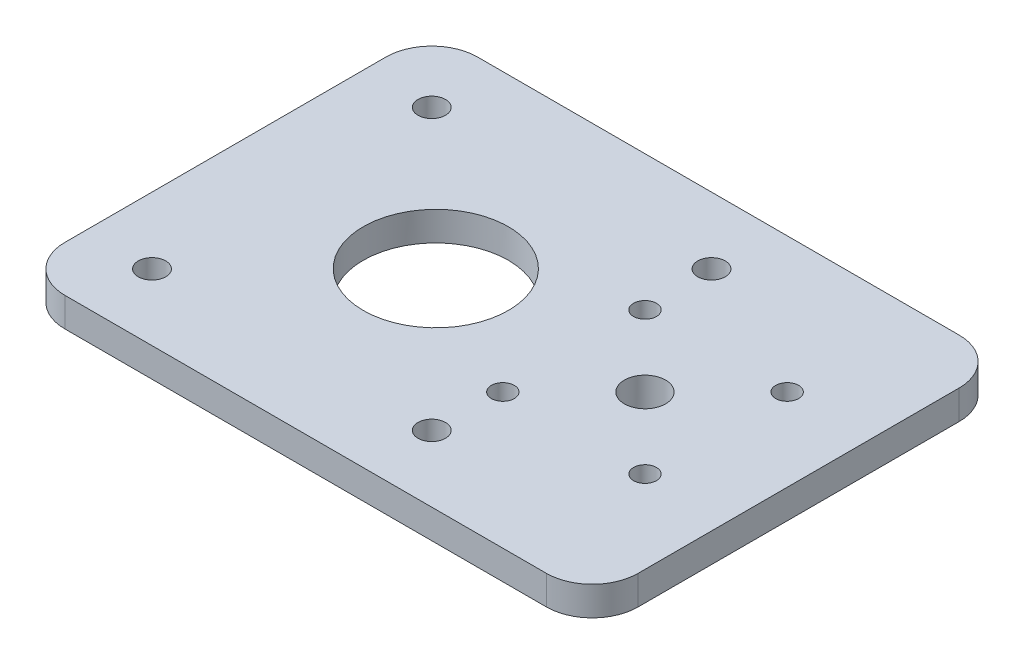
ISO-10303-21;
HEADER;
FILE_DESCRIPTION(('STEP AP214'),'2;1');
FILE_NAME('part.step','',(''),(''),'','','');
FILE_SCHEMA(('AUTOMOTIVE_DESIGN { 1 0 10303 214 1 1 1 1 }'));
ENDSEC;
DATA;
#1=APPLICATION_CONTEXT('core data for automotive mechanical design processes');
#2=APPLICATION_PROTOCOL_DEFINITION('international standard','automotive_design',2000,#1);
#3=PRODUCT_CONTEXT('',#1,'mechanical');
#4=PRODUCT('Part','Part','',(#3));
#5=PRODUCT_RELATED_PRODUCT_CATEGORY('part','',(#4));
#6=PRODUCT_DEFINITION_FORMATION('','',#4);
#7=PRODUCT_DEFINITION_CONTEXT('part definition',#1,'design');
#8=PRODUCT_DEFINITION('design','',#6,#7);
#9=PRODUCT_DEFINITION_SHAPE('','',#8);
#10=(LENGTH_UNIT() NAMED_UNIT(*) SI_UNIT(.MILLI.,.METRE.));
#11=(NAMED_UNIT(*) PLANE_ANGLE_UNIT() SI_UNIT($,.RADIAN.));
#12=(NAMED_UNIT(*) SI_UNIT($,.STERADIAN.) SOLID_ANGLE_UNIT());
#13=UNCERTAINTY_MEASURE_WITH_UNIT(LENGTH_MEASURE(1.E-05),#10,'distance_accuracy_value','');
#14=(GEOMETRIC_REPRESENTATION_CONTEXT(3) GLOBAL_UNCERTAINTY_ASSIGNED_CONTEXT((#13)) GLOBAL_UNIT_ASSIGNED_CONTEXT((#10,
#11,#12)) REPRESENTATION_CONTEXT('',''));
#15=CARTESIAN_POINT('',(0.,0.,0.));
#16=DIRECTION('',(0.,0.,1.));
#17=DIRECTION('',(1.,0.,0.));
#18=AXIS2_PLACEMENT_3D('',#15,#16,#17);
#19=CARTESIAN_POINT('',(0.,6.35,0.));
#20=DIRECTION('',(1.,0.,0.));
#21=DIRECTION('',(0.,0.,-1.));
#22=AXIS2_PLACEMENT_3D('',#19,#20,#21);
#23=PLANE('',#22);
#24=DIRECTION('',(0.,0.,1.));
#25=VECTOR('',#24,1.);
#26=CARTESIAN_POINT('',(0.,0.,0.));
#27=LINE('',#26,#25);
#28=CARTESIAN_POINT('',(0.,0.,-80.));
#29=VERTEX_POINT('',#28);
#30=CARTESIAN_POINT('',(0.,0.,-10.));
#31=VERTEX_POINT('',#30);
#32=EDGE_CURVE('E126',#29,#31,#27,.T.);
#33=ORIENTED_EDGE('',*,*,#32,.T.);
#34=DIRECTION('',(0.,-1.,0.));
#35=VECTOR('',#34,1.);
#36=CARTESIAN_POINT('',(0.,6.35,-10.));
#37=LINE('',#36,#35);
#38=CARTESIAN_POINT('',(0.,6.35,-10.));
#39=VERTEX_POINT('',#38);
#40=EDGE_CURVE('E104',#31,#39,#37,.F.);
#41=ORIENTED_EDGE('',*,*,#40,.T.);
#42=DIRECTION('',(0.,0.,1.));
#43=VECTOR('',#42,1.);
#44=CARTESIAN_POINT('',(0.,6.35,0.));
#45=LINE('',#44,#43);
#46=CARTESIAN_POINT('',(0.,6.35,-80.));
#47=VERTEX_POINT('',#46);
#48=EDGE_CURVE('E136',#47,#39,#45,.T.);
#49=ORIENTED_EDGE('',*,*,#48,.F.);
#50=DIRECTION('',(0.,-1.,0.));
#51=VECTOR('',#50,1.);
#52=CARTESIAN_POINT('',(0.,6.35,-80.));
#53=LINE('',#52,#51);
#54=EDGE_CURVE('E109',#47,#29,#53,.T.);
#55=ORIENTED_EDGE('',*,*,#54,.T.);
#56=EDGE_LOOP('',(#33,#41,#49,#55));
#57=FACE_BOUND('',#56,.T.);
#58=ADVANCED_FACE('F32',(#57),#23,.F.);
#59=CARTESIAN_POINT('',(0.,6.35,0.));
#60=DIRECTION('',(0.,0.,-1.));
#61=DIRECTION('',(-1.,0.,0.));
#62=AXIS2_PLACEMENT_3D('',#59,#60,#61);
#63=PLANE('',#62);
#64=DIRECTION('',(1.,0.,0.));
#65=VECTOR('',#64,1.);
#66=CARTESIAN_POINT('',(0.,6.35,0.));
#67=LINE('',#66,#65);
#68=CARTESIAN_POINT('',(10.,6.35,0.));
#69=VERTEX_POINT('',#68);
#70=CARTESIAN_POINT('',(115.,6.35,0.));
#71=VERTEX_POINT('',#70);
#72=EDGE_CURVE('E119',#69,#71,#67,.T.);
#73=ORIENTED_EDGE('',*,*,#72,.F.);
#74=DIRECTION('',(0.,-1.,0.));
#75=VECTOR('',#74,1.);
#76=CARTESIAN_POINT('',(10.,6.35,0.));
#77=LINE('',#76,#75);
#78=CARTESIAN_POINT('',(10.,0.,0.));
#79=VERTEX_POINT('',#78);
#80=EDGE_CURVE('E103',#69,#79,#77,.T.);
#81=ORIENTED_EDGE('',*,*,#80,.T.);
#82=DIRECTION('',(1.,0.,0.));
#83=VECTOR('',#82,1.);
#84=CARTESIAN_POINT('',(0.,0.,0.));
#85=LINE('',#84,#83);
#86=CARTESIAN_POINT('',(115.,0.,0.));
#87=VERTEX_POINT('',#86);
#88=EDGE_CURVE('E116',#79,#87,#85,.T.);
#89=ORIENTED_EDGE('',*,*,#88,.T.);
#90=DIRECTION('',(0.,-1.,0.));
#91=VECTOR('',#90,1.);
#92=CARTESIAN_POINT('',(115.,6.35,0.));
#93=LINE('',#92,#91);
#94=EDGE_CURVE('E121',#87,#71,#93,.F.);
#95=ORIENTED_EDGE('',*,*,#94,.T.);
#96=EDGE_LOOP('',(#73,#81,#89,#95));
#97=FACE_BOUND('',#96,.T.);
#98=ADVANCED_FACE('F115',(#97),#63,.F.);
#99=CARTESIAN_POINT('',(125.,6.35,0.));
#100=DIRECTION('',(-1.,0.,0.));
#101=DIRECTION('',(0.,0.,1.));
#102=AXIS2_PLACEMENT_3D('',#99,#100,#101);
#103=PLANE('',#102);
#104=DIRECTION('',(0.,0.,-1.));
#105=VECTOR('',#104,1.);
#106=CARTESIAN_POINT('',(125.,0.,0.));
#107=LINE('',#106,#105);
#108=CARTESIAN_POINT('',(125.,0.,-10.));
#109=VERTEX_POINT('',#108);
#110=CARTESIAN_POINT('',(125.,0.,-80.));
#111=VERTEX_POINT('',#110);
#112=EDGE_CURVE('E125',#109,#111,#107,.T.);
#113=ORIENTED_EDGE('',*,*,#112,.T.);
#114=DIRECTION('',(0.,-1.,0.));
#115=VECTOR('',#114,1.);
#116=CARTESIAN_POINT('',(125.,6.35,-80.));
#117=LINE('',#116,#115);
#118=CARTESIAN_POINT('',(125.,6.35,-80.));
#119=VERTEX_POINT('',#118);
#120=EDGE_CURVE('E11',#111,#119,#117,.F.);
#121=ORIENTED_EDGE('',*,*,#120,.T.);
#122=DIRECTION('',(0.,0.,-1.));
#123=VECTOR('',#122,1.);
#124=CARTESIAN_POINT('',(125.,6.35,0.));
#125=LINE('',#124,#123);
#126=CARTESIAN_POINT('',(125.,6.35,-10.));
#127=VERTEX_POINT('',#126);
#128=EDGE_CURVE('E198',#127,#119,#125,.T.);
#129=ORIENTED_EDGE('',*,*,#128,.F.);
#130=DIRECTION('',(0.,-1.,0.));
#131=VECTOR('',#130,1.);
#132=CARTESIAN_POINT('',(125.,6.35,-10.));
#133=LINE('',#132,#131);
#134=EDGE_CURVE('E41',#127,#109,#133,.T.);
#135=ORIENTED_EDGE('',*,*,#134,.T.);
#136=EDGE_LOOP('',(#113,#121,#129,#135));
#137=FACE_BOUND('',#136,.T.);
#138=ADVANCED_FACE('F196',(#137),#103,.F.);
#139=CARTESIAN_POINT('',(0.,6.35,-90.));
#140=DIRECTION('',(0.,0.,1.));
#141=DIRECTION('',(1.,0.,0.));
#142=AXIS2_PLACEMENT_3D('',#139,#140,#141);
#143=PLANE('',#142);
#144=DIRECTION('',(-1.,0.,0.));
#145=VECTOR('',#144,1.);
#146=CARTESIAN_POINT('',(0.,0.,-90.));
#147=LINE('',#146,#145);
#148=CARTESIAN_POINT('',(115.,0.,-90.));
#149=VERTEX_POINT('',#148);
#150=CARTESIAN_POINT('',(10.,0.,-90.));
#151=VERTEX_POINT('',#150);
#152=EDGE_CURVE('E129',#149,#151,#147,.T.);
#153=ORIENTED_EDGE('',*,*,#152,.T.);
#154=DIRECTION('',(0.,-1.,0.));
#155=VECTOR('',#154,1.);
#156=CARTESIAN_POINT('',(10.,6.35,-90.));
#157=LINE('',#156,#155);
#158=CARTESIAN_POINT('',(10.,6.35,-90.));
#159=VERTEX_POINT('',#158);
#160=EDGE_CURVE('E48',#151,#159,#157,.F.);
#161=ORIENTED_EDGE('',*,*,#160,.T.);
#162=DIRECTION('',(-1.,0.,0.));
#163=VECTOR('',#162,1.);
#164=CARTESIAN_POINT('',(0.,6.35,-90.));
#165=LINE('',#164,#163);
#166=CARTESIAN_POINT('',(115.,6.35,-90.));
#167=VERTEX_POINT('',#166);
#168=EDGE_CURVE('E172',#167,#159,#165,.T.);
#169=ORIENTED_EDGE('',*,*,#168,.F.);
#170=DIRECTION('',(0.,-1.,0.));
#171=VECTOR('',#170,1.);
#172=CARTESIAN_POINT('',(115.,6.35,-90.));
#173=LINE('',#172,#171);
#174=EDGE_CURVE('E188',#167,#149,#173,.T.);
#175=ORIENTED_EDGE('',*,*,#174,.T.);
#176=EDGE_LOOP('',(#153,#161,#169,#175));
#177=FACE_BOUND('',#176,.T.);
#178=ADVANCED_FACE('F205',(#177),#143,.F.);
#179=CARTESIAN_POINT('',(0.,6.35,0.));
#180=DIRECTION('',(0.,-1.,0.));
#181=DIRECTION('',(0.,0.,-1.));
#182=AXIS2_PLACEMENT_3D('',#179,#180,#181);
#183=PLANE('',#182);
#184=CARTESIAN_POINT('',(45.3898859795867,6.35,-45.4966713954477));
#185=DIRECTION('',(0.,1.,0.));
#186=DIRECTION('',(0.,0.,1.));
#187=AXIS2_PLACEMENT_3D('',#184,#185,#186);
#188=CIRCLE('',#187,15.8256034533935);
#189=CARTESIAN_POINT('',(45.3898859795867,6.35,-29.6710679420542));
#190=VERTEX_POINT('',#189);
#191=EDGE_CURVE('E230',#190,#190,#188,.T.);
#192=ORIENTED_EDGE('',*,*,#191,.F.);
#193=EDGE_LOOP('',(#192));
#194=FACE_BOUND('',#193,.T.);
#195=CARTESIAN_POINT('',(107.,6.35,-29.5000000000002));
#196=DIRECTION('',(0.,1.,0.));
#197=DIRECTION('',(0.,0.,1.));
#198=AXIS2_PLACEMENT_3D('',#195,#196,#197);
#199=CIRCLE('',#198,2.49999999999998);
#200=CARTESIAN_POINT('',(107.,6.35,-27.0000000000002));
#201=VERTEX_POINT('',#200);
#202=EDGE_CURVE('E171',#201,#201,#199,.T.);
#203=ORIENTED_EDGE('',*,*,#202,.F.);
#204=EDGE_LOOP('',(#203));
#205=FACE_BOUND('',#204,.T.);
#206=CARTESIAN_POINT('',(76.0000000000003,6.35,-29.5));
#207=DIRECTION('',(0.,1.,0.));
#208=DIRECTION('',(0.,0.,1.));
#209=AXIS2_PLACEMENT_3D('',#206,#207,#208);
#210=CIRCLE('',#209,2.49999999999999);
#211=CARTESIAN_POINT('',(76.0000000000003,6.35,-27.));
#212=VERTEX_POINT('',#211);
#213=EDGE_CURVE('E167',#212,#212,#210,.T.);
#214=ORIENTED_EDGE('',*,*,#213,.F.);
#215=EDGE_LOOP('',(#214));
#216=FACE_BOUND('',#215,.T.);
#217=CARTESIAN_POINT('',(76.,6.35,-60.5));
#218=DIRECTION('',(0.,1.,0.));
#219=DIRECTION('',(0.,0.,1.));
#220=AXIS2_PLACEMENT_3D('',#217,#218,#219);
#221=CIRCLE('',#220,2.5);
#222=CARTESIAN_POINT('',(76.,6.35,-58.));
#223=VERTEX_POINT('',#222);
#224=EDGE_CURVE('E163',#223,#223,#221,.T.);
#225=ORIENTED_EDGE('',*,*,#224,.F.);
#226=EDGE_LOOP('',(#225));
#227=FACE_BOUND('',#226,.T.);
#228=CARTESIAN_POINT('',(107.,6.35,-60.5000000000002));
#229=DIRECTION('',(0.,1.,0.));
#230=DIRECTION('',(0.,0.,1.));
#231=AXIS2_PLACEMENT_3D('',#228,#229,#230);
#232=CIRCLE('',#231,2.50000000000001);
#233=CARTESIAN_POINT('',(107.,6.35,-58.0000000000002));
#234=VERTEX_POINT('',#233);
#235=EDGE_CURVE('E159',#234,#234,#232,.T.);
#236=ORIENTED_EDGE('',*,*,#235,.F.);
#237=EDGE_LOOP('',(#236));
#238=FACE_BOUND('',#237,.T.);
#239=CARTESIAN_POINT('',(91.5,6.35,-45.));
#240=DIRECTION('',(0.,1.,0.));
#241=DIRECTION('',(0.,0.,1.));
#242=AXIS2_PLACEMENT_3D('',#239,#240,#241);
#243=CIRCLE('',#242,4.50000000000001);
#244=CARTESIAN_POINT('',(91.5,6.35,-40.5));
#245=VERTEX_POINT('',#244);
#246=EDGE_CURVE('E155',#245,#245,#243,.T.);
#247=ORIENTED_EDGE('',*,*,#246,.F.);
#248=EDGE_LOOP('',(#247));
#249=FACE_BOUND('',#248,.T.);
#250=CARTESIAN_POINT('',(14.5,6.35,-75.5));
#251=DIRECTION('',(0.,1.,0.));
#252=DIRECTION('',(0.,0.,1.));
#253=AXIS2_PLACEMENT_3D('',#250,#251,#252);
#254=CIRCLE('',#253,3.00000000000001);
#255=CARTESIAN_POINT('',(14.5,6.35,-72.5));
#256=VERTEX_POINT('',#255);
#257=EDGE_CURVE('E151',#256,#256,#254,.T.);
#258=ORIENTED_EDGE('',*,*,#257,.F.);
#259=EDGE_LOOP('',(#258));
#260=FACE_BOUND('',#259,.T.);
#261=CARTESIAN_POINT('',(75.5,6.35,-75.5));
#262=DIRECTION('',(0.,1.,0.));
#263=DIRECTION('',(0.,0.,1.));
#264=AXIS2_PLACEMENT_3D('',#261,#262,#263);
#265=CIRCLE('',#264,3.00000000000001);
#266=CARTESIAN_POINT('',(75.5,6.35,-72.5));
#267=VERTEX_POINT('',#266);
#268=EDGE_CURVE('E147',#267,#267,#265,.F.);
#269=ORIENTED_EDGE('',*,*,#268,.T.);
#270=EDGE_LOOP('',(#269));
#271=FACE_BOUND('',#270,.T.);
#272=CARTESIAN_POINT('',(75.5,6.35,-14.5));
#273=DIRECTION('',(0.,1.,0.));
#274=DIRECTION('',(0.,0.,1.));
#275=AXIS2_PLACEMENT_3D('',#272,#273,#274);
#276=CIRCLE('',#275,3.00000000000001);
#277=CARTESIAN_POINT('',(75.5,6.35,-11.5));
#278=VERTEX_POINT('',#277);
#279=EDGE_CURVE('E143',#278,#278,#276,.T.);
#280=ORIENTED_EDGE('',*,*,#279,.F.);
#281=EDGE_LOOP('',(#280));
#282=FACE_BOUND('',#281,.T.);
#283=CARTESIAN_POINT('',(14.5,6.35,-14.5));
#284=DIRECTION('',(0.,1.,0.));
#285=DIRECTION('',(0.,0.,1.));
#286=AXIS2_PLACEMENT_3D('',#283,#284,#285);
#287=CIRCLE('',#286,3.);
#288=CARTESIAN_POINT('',(14.5,6.35,-11.5));
#289=VERTEX_POINT('',#288);
#290=EDGE_CURVE('E139',#289,#289,#287,.F.);
#291=ORIENTED_EDGE('',*,*,#290,.T.);
#292=EDGE_LOOP('',(#291));
#293=FACE_BOUND('',#292,.T.);
#294=ORIENTED_EDGE('',*,*,#48,.T.);
#295=CARTESIAN_POINT('',(10.,6.35,-10.));
#296=DIRECTION('',(0.,-1.,0.));
#297=DIRECTION('',(0.,0.,-1.));
#298=AXIS2_PLACEMENT_3D('',#295,#296,#297);
#299=CIRCLE('',#298,10.);
#300=EDGE_CURVE('E186',#39,#69,#299,.F.);
#301=ORIENTED_EDGE('',*,*,#300,.T.);
#302=ORIENTED_EDGE('',*,*,#72,.T.);
#303=CARTESIAN_POINT('',(115.,6.35,-10.));
#304=DIRECTION('',(0.,-1.,0.));
#305=DIRECTION('',(0.,0.,-1.));
#306=AXIS2_PLACEMENT_3D('',#303,#304,#305);
#307=CIRCLE('',#306,10.);
#308=EDGE_CURVE('E181',#71,#127,#307,.F.);
#309=ORIENTED_EDGE('',*,*,#308,.T.);
#310=ORIENTED_EDGE('',*,*,#128,.T.);
#311=CARTESIAN_POINT('',(115.,6.35,-80.));
#312=DIRECTION('',(0.,-1.,0.));
#313=DIRECTION('',(0.,0.,-1.));
#314=AXIS2_PLACEMENT_3D('',#311,#312,#313);
#315=CIRCLE('',#314,10.);
#316=EDGE_CURVE('E55',#119,#167,#315,.F.);
#317=ORIENTED_EDGE('',*,*,#316,.T.);
#318=ORIENTED_EDGE('',*,*,#168,.T.);
#319=CARTESIAN_POINT('',(10.,6.35,-80.));
#320=DIRECTION('',(0.,-1.,0.));
#321=DIRECTION('',(0.,0.,-1.));
#322=AXIS2_PLACEMENT_3D('',#319,#320,#321);
#323=CIRCLE('',#322,10.);
#324=EDGE_CURVE('E184',#159,#47,#323,.F.);
#325=ORIENTED_EDGE('',*,*,#324,.T.);
#326=EDGE_LOOP('',(#294,#301,#302,#309,#310,#317,#318,#325));
#327=FACE_BOUND('',#326,.T.);
#328=ADVANCED_FACE('F242',(#194,#205,#216,#227,#238,#249,#260,#271,#282,#293,#327),#183,.F.);
#329=CARTESIAN_POINT('',(0.,0.,0.));
#330=DIRECTION('',(0.,-1.,0.));
#331=DIRECTION('',(0.,0.,-1.));
#332=AXIS2_PLACEMENT_3D('',#329,#330,#331);
#333=PLANE('',#332);
#334=CARTESIAN_POINT('',(45.3898859795867,0.,-45.4966713954477));
#335=DIRECTION('',(0.,-1.,0.));
#336=DIRECTION('',(0.,0.,-1.));
#337=AXIS2_PLACEMENT_3D('',#334,#335,#336);
#338=CIRCLE('',#337,15.8256034533935);
#339=CARTESIAN_POINT('',(45.3898859795867,0.,-61.3222748488411));
#340=VERTEX_POINT('',#339);
#341=EDGE_CURVE('E36',#340,#340,#338,.T.);
#342=ORIENTED_EDGE('',*,*,#341,.F.);
#343=EDGE_LOOP('',(#342));
#344=FACE_BOUND('',#343,.T.);
#345=CARTESIAN_POINT('',(107.,0.,-29.5000000000002));
#346=DIRECTION('',(0.,-1.,0.));
#347=DIRECTION('',(0.,0.,-1.));
#348=AXIS2_PLACEMENT_3D('',#345,#346,#347);
#349=CIRCLE('',#348,2.49999999999998);
#350=CARTESIAN_POINT('',(107.,0.,-32.0000000000002));
#351=VERTEX_POINT('',#350);
#352=EDGE_CURVE('E168',#351,#351,#349,.T.);
#353=ORIENTED_EDGE('',*,*,#352,.F.);
#354=EDGE_LOOP('',(#353));
#355=FACE_BOUND('',#354,.T.);
#356=CARTESIAN_POINT('',(76.0000000000003,0.,-29.5));
#357=DIRECTION('',(0.,-1.,0.));
#358=DIRECTION('',(0.,0.,-1.));
#359=AXIS2_PLACEMENT_3D('',#356,#357,#358);
#360=CIRCLE('',#359,2.49999999999999);
#361=CARTESIAN_POINT('',(76.0000000000003,0.,-32.));
#362=VERTEX_POINT('',#361);
#363=EDGE_CURVE('E164',#362,#362,#360,.T.);
#364=ORIENTED_EDGE('',*,*,#363,.F.);
#365=EDGE_LOOP('',(#364));
#366=FACE_BOUND('',#365,.T.);
#367=CARTESIAN_POINT('',(76.,0.,-60.5));
#368=DIRECTION('',(0.,-1.,0.));
#369=DIRECTION('',(0.,0.,-1.));
#370=AXIS2_PLACEMENT_3D('',#367,#368,#369);
#371=CIRCLE('',#370,2.5);
#372=CARTESIAN_POINT('',(76.,0.,-63.));
#373=VERTEX_POINT('',#372);
#374=EDGE_CURVE('E160',#373,#373,#371,.T.);
#375=ORIENTED_EDGE('',*,*,#374,.F.);
#376=EDGE_LOOP('',(#375));
#377=FACE_BOUND('',#376,.T.);
#378=CARTESIAN_POINT('',(107.,0.,-60.5000000000002));
#379=DIRECTION('',(0.,-1.,0.));
#380=DIRECTION('',(0.,0.,-1.));
#381=AXIS2_PLACEMENT_3D('',#378,#379,#380);
#382=CIRCLE('',#381,2.50000000000001);
#383=CARTESIAN_POINT('',(107.,0.,-63.0000000000002));
#384=VERTEX_POINT('',#383);
#385=EDGE_CURVE('E156',#384,#384,#382,.T.);
#386=ORIENTED_EDGE('',*,*,#385,.F.);
#387=EDGE_LOOP('',(#386));
#388=FACE_BOUND('',#387,.T.);
#389=CARTESIAN_POINT('',(91.5,0.,-45.));
#390=DIRECTION('',(0.,-1.,0.));
#391=DIRECTION('',(0.,0.,-1.));
#392=AXIS2_PLACEMENT_3D('',#389,#390,#391);
#393=CIRCLE('',#392,4.50000000000001);
#394=CARTESIAN_POINT('',(91.5,0.,-49.5));
#395=VERTEX_POINT('',#394);
#396=EDGE_CURVE('E152',#395,#395,#393,.T.);
#397=ORIENTED_EDGE('',*,*,#396,.F.);
#398=EDGE_LOOP('',(#397));
#399=FACE_BOUND('',#398,.T.);
#400=CARTESIAN_POINT('',(14.5,0.,-75.5));
#401=DIRECTION('',(0.,-1.,0.));
#402=DIRECTION('',(0.,0.,-1.));
#403=AXIS2_PLACEMENT_3D('',#400,#401,#402);
#404=CIRCLE('',#403,3.00000000000001);
#405=CARTESIAN_POINT('',(14.5,0.,-78.5));
#406=VERTEX_POINT('',#405);
#407=EDGE_CURVE('E148',#406,#406,#404,.T.);
#408=ORIENTED_EDGE('',*,*,#407,.F.);
#409=EDGE_LOOP('',(#408));
#410=FACE_BOUND('',#409,.T.);
#411=CARTESIAN_POINT('',(75.5,0.,-75.5));
#412=DIRECTION('',(0.,-1.,0.));
#413=DIRECTION('',(0.,0.,-1.));
#414=AXIS2_PLACEMENT_3D('',#411,#412,#413);
#415=CIRCLE('',#414,3.00000000000001);
#416=CARTESIAN_POINT('',(75.5,0.,-78.5));
#417=VERTEX_POINT('',#416);
#418=EDGE_CURVE('E144',#417,#417,#415,.F.);
#419=ORIENTED_EDGE('',*,*,#418,.T.);
#420=EDGE_LOOP('',(#419));
#421=FACE_BOUND('',#420,.T.);
#422=CARTESIAN_POINT('',(75.5,0.,-14.5));
#423=DIRECTION('',(0.,-1.,0.));
#424=DIRECTION('',(0.,0.,-1.));
#425=AXIS2_PLACEMENT_3D('',#422,#423,#424);
#426=CIRCLE('',#425,3.00000000000001);
#427=CARTESIAN_POINT('',(75.5,0.,-17.5));
#428=VERTEX_POINT('',#427);
#429=EDGE_CURVE('E140',#428,#428,#426,.T.);
#430=ORIENTED_EDGE('',*,*,#429,.F.);
#431=EDGE_LOOP('',(#430));
#432=FACE_BOUND('',#431,.T.);
#433=CARTESIAN_POINT('',(14.5,0.,-14.5));
#434=DIRECTION('',(0.,-1.,0.));
#435=DIRECTION('',(0.,0.,-1.));
#436=AXIS2_PLACEMENT_3D('',#433,#434,#435);
#437=CIRCLE('',#436,3.);
#438=CARTESIAN_POINT('',(14.5,0.,-17.5));
#439=VERTEX_POINT('',#438);
#440=EDGE_CURVE('E131',#439,#439,#437,.F.);
#441=ORIENTED_EDGE('',*,*,#440,.T.);
#442=EDGE_LOOP('',(#441));
#443=FACE_BOUND('',#442,.T.);
#444=ORIENTED_EDGE('',*,*,#88,.F.);
#445=CARTESIAN_POINT('',(10.,0.,-10.));
#446=DIRECTION('',(0.,-1.,0.));
#447=DIRECTION('',(0.,0.,-1.));
#448=AXIS2_PLACEMENT_3D('',#445,#446,#447);
#449=CIRCLE('',#448,10.);
#450=EDGE_CURVE('E99',#79,#31,#449,.T.);
#451=ORIENTED_EDGE('',*,*,#450,.T.);
#452=ORIENTED_EDGE('',*,*,#32,.F.);
#453=CARTESIAN_POINT('',(10.,0.,-80.));
#454=DIRECTION('',(0.,-1.,0.));
#455=DIRECTION('',(0.,0.,-1.));
#456=AXIS2_PLACEMENT_3D('',#453,#454,#455);
#457=CIRCLE('',#456,10.);
#458=EDGE_CURVE('E110',#29,#151,#457,.T.);
#459=ORIENTED_EDGE('',*,*,#458,.T.);
#460=ORIENTED_EDGE('',*,*,#152,.F.);
#461=CARTESIAN_POINT('',(115.,0.,-80.));
#462=DIRECTION('',(0.,-1.,0.));
#463=DIRECTION('',(0.,0.,-1.));
#464=AXIS2_PLACEMENT_3D('',#461,#462,#463);
#465=CIRCLE('',#464,10.);
#466=EDGE_CURVE('E175',#149,#111,#465,.T.);
#467=ORIENTED_EDGE('',*,*,#466,.T.);
#468=ORIENTED_EDGE('',*,*,#112,.F.);
#469=CARTESIAN_POINT('',(115.,0.,-10.));
#470=DIRECTION('',(0.,-1.,0.));
#471=DIRECTION('',(0.,0.,-1.));
#472=AXIS2_PLACEMENT_3D('',#469,#470,#471);
#473=CIRCLE('',#472,10.);
#474=EDGE_CURVE('E120',#109,#87,#473,.T.);
#475=ORIENTED_EDGE('',*,*,#474,.T.);
#476=EDGE_LOOP('',(#444,#451,#452,#459,#460,#467,#468,#475));
#477=FACE_BOUND('',#476,.T.);
#478=ADVANCED_FACE('F123',(#344,#355,#366,#377,#388,#399,#410,#421,#432,#443,#477),#333,.T.);
#479=CARTESIAN_POINT('',(14.5,-3.65,-14.5));
#480=DIRECTION('',(0.,1.,0.));
#481=DIRECTION('',(0.,0.,1.));
#482=AXIS2_PLACEMENT_3D('',#479,#480,#481);
#483=CYLINDRICAL_SURFACE('',#482,3.);
#484=ORIENTED_EDGE('',*,*,#440,.F.);
#485=EDGE_LOOP('',(#484));
#486=FACE_BOUND('',#485,.T.);
#487=ORIENTED_EDGE('',*,*,#290,.F.);
#488=EDGE_LOOP('',(#487));
#489=FACE_BOUND('',#488,.T.);
#490=ADVANCED_FACE('F241',(#486,#489),#483,.F.);
#491=CARTESIAN_POINT('',(75.5,-3.65,-14.5));
#492=DIRECTION('',(0.,1.,0.));
#493=DIRECTION('',(0.,0.,1.));
#494=AXIS2_PLACEMENT_3D('',#491,#492,#493);
#495=CYLINDRICAL_SURFACE('',#494,3.00000000000001);
#496=ORIENTED_EDGE('',*,*,#429,.T.);
#497=EDGE_LOOP('',(#496));
#498=FACE_BOUND('',#497,.T.);
#499=ORIENTED_EDGE('',*,*,#279,.T.);
#500=EDGE_LOOP('',(#499));
#501=FACE_BOUND('',#500,.T.);
#502=ADVANCED_FACE('F264',(#498,#501),#495,.F.);
#503=CARTESIAN_POINT('',(75.5,-3.65,-75.5));
#504=DIRECTION('',(0.,1.,0.));
#505=DIRECTION('',(0.,0.,1.));
#506=AXIS2_PLACEMENT_3D('',#503,#504,#505);
#507=CYLINDRICAL_SURFACE('',#506,3.00000000000001);
#508=ORIENTED_EDGE('',*,*,#418,.F.);
#509=EDGE_LOOP('',(#508));
#510=FACE_BOUND('',#509,.T.);
#511=ORIENTED_EDGE('',*,*,#268,.F.);
#512=EDGE_LOOP('',(#511));
#513=FACE_BOUND('',#512,.T.);
#514=ADVANCED_FACE('F297',(#510,#513),#507,.F.);
#515=CARTESIAN_POINT('',(14.5,-3.65,-75.5));
#516=DIRECTION('',(0.,1.,0.));
#517=DIRECTION('',(0.,0.,1.));
#518=AXIS2_PLACEMENT_3D('',#515,#516,#517);
#519=CYLINDRICAL_SURFACE('',#518,3.00000000000001);
#520=ORIENTED_EDGE('',*,*,#407,.T.);
#521=EDGE_LOOP('',(#520));
#522=FACE_BOUND('',#521,.T.);
#523=ORIENTED_EDGE('',*,*,#257,.T.);
#524=EDGE_LOOP('',(#523));
#525=FACE_BOUND('',#524,.T.);
#526=ADVANCED_FACE('F301',(#522,#525),#519,.F.);
#527=CARTESIAN_POINT('',(91.5,-3.65,-45.));
#528=DIRECTION('',(0.,1.,0.));
#529=DIRECTION('',(0.,0.,1.));
#530=AXIS2_PLACEMENT_3D('',#527,#528,#529);
#531=CYLINDRICAL_SURFACE('',#530,4.50000000000001);
#532=ORIENTED_EDGE('',*,*,#396,.T.);
#533=EDGE_LOOP('',(#532));
#534=FACE_BOUND('',#533,.T.);
#535=ORIENTED_EDGE('',*,*,#246,.T.);
#536=EDGE_LOOP('',(#535));
#537=FACE_BOUND('',#536,.T.);
#538=ADVANCED_FACE('F305',(#534,#537),#531,.F.);
#539=CARTESIAN_POINT('',(107.,-3.65,-60.5000000000002));
#540=DIRECTION('',(0.,1.,0.));
#541=DIRECTION('',(0.,0.,1.));
#542=AXIS2_PLACEMENT_3D('',#539,#540,#541);
#543=CYLINDRICAL_SURFACE('',#542,2.50000000000001);
#544=ORIENTED_EDGE('',*,*,#385,.T.);
#545=EDGE_LOOP('',(#544));
#546=FACE_BOUND('',#545,.T.);
#547=ORIENTED_EDGE('',*,*,#235,.T.);
#548=EDGE_LOOP('',(#547));
#549=FACE_BOUND('',#548,.T.);
#550=ADVANCED_FACE('F309',(#546,#549),#543,.F.);
#551=CARTESIAN_POINT('',(76.,-3.65,-60.5));
#552=DIRECTION('',(0.,1.,0.));
#553=DIRECTION('',(0.,0.,1.));
#554=AXIS2_PLACEMENT_3D('',#551,#552,#553);
#555=CYLINDRICAL_SURFACE('',#554,2.5);
#556=ORIENTED_EDGE('',*,*,#374,.T.);
#557=EDGE_LOOP('',(#556));
#558=FACE_BOUND('',#557,.T.);
#559=ORIENTED_EDGE('',*,*,#224,.T.);
#560=EDGE_LOOP('',(#559));
#561=FACE_BOUND('',#560,.T.);
#562=ADVANCED_FACE('F313',(#558,#561),#555,.F.);
#563=CARTESIAN_POINT('',(76.0000000000003,-3.65,-29.5));
#564=DIRECTION('',(0.,1.,0.));
#565=DIRECTION('',(0.,0.,1.));
#566=AXIS2_PLACEMENT_3D('',#563,#564,#565);
#567=CYLINDRICAL_SURFACE('',#566,2.49999999999999);
#568=ORIENTED_EDGE('',*,*,#363,.T.);
#569=EDGE_LOOP('',(#568));
#570=FACE_BOUND('',#569,.T.);
#571=ORIENTED_EDGE('',*,*,#213,.T.);
#572=EDGE_LOOP('',(#571));
#573=FACE_BOUND('',#572,.T.);
#574=ADVANCED_FACE('F317',(#570,#573),#567,.F.);
#575=CARTESIAN_POINT('',(107.,-3.65,-29.5000000000002));
#576=DIRECTION('',(0.,1.,0.));
#577=DIRECTION('',(0.,0.,1.));
#578=AXIS2_PLACEMENT_3D('',#575,#576,#577);
#579=CYLINDRICAL_SURFACE('',#578,2.49999999999998);
#580=ORIENTED_EDGE('',*,*,#352,.T.);
#581=EDGE_LOOP('',(#580));
#582=FACE_BOUND('',#581,.T.);
#583=ORIENTED_EDGE('',*,*,#202,.T.);
#584=EDGE_LOOP('',(#583));
#585=FACE_BOUND('',#584,.T.);
#586=ADVANCED_FACE('F282',(#582,#585),#579,.F.);
#587=CARTESIAN_POINT('',(10.,6.35,-10.));
#588=DIRECTION('',(0.,-1.,0.));
#589=DIRECTION('',(0.,0.,-1.));
#590=AXIS2_PLACEMENT_3D('',#587,#588,#589);
#591=CYLINDRICAL_SURFACE('',#590,10.);
#592=ORIENTED_EDGE('',*,*,#300,.F.);
#593=ORIENTED_EDGE('',*,*,#40,.F.);
#594=ORIENTED_EDGE('',*,*,#450,.F.);
#595=ORIENTED_EDGE('',*,*,#80,.F.);
#596=EDGE_LOOP('',(#592,#593,#594,#595));
#597=FACE_BOUND('',#596,.T.);
#598=ADVANCED_FACE('F102',(#597),#591,.T.);
#599=CARTESIAN_POINT('',(10.,6.35,-80.));
#600=DIRECTION('',(0.,-1.,0.));
#601=DIRECTION('',(0.,0.,-1.));
#602=AXIS2_PLACEMENT_3D('',#599,#600,#601);
#603=CYLINDRICAL_SURFACE('',#602,10.);
#604=ORIENTED_EDGE('',*,*,#324,.F.);
#605=ORIENTED_EDGE('',*,*,#160,.F.);
#606=ORIENTED_EDGE('',*,*,#458,.F.);
#607=ORIENTED_EDGE('',*,*,#54,.F.);
#608=EDGE_LOOP('',(#604,#605,#606,#607));
#609=FACE_BOUND('',#608,.T.);
#610=ADVANCED_FACE('F275',(#609),#603,.T.);
#611=CARTESIAN_POINT('',(115.,6.35,-80.));
#612=DIRECTION('',(0.,-1.,0.));
#613=DIRECTION('',(0.,0.,-1.));
#614=AXIS2_PLACEMENT_3D('',#611,#612,#613);
#615=CYLINDRICAL_SURFACE('',#614,10.);
#616=ORIENTED_EDGE('',*,*,#316,.F.);
#617=ORIENTED_EDGE('',*,*,#120,.F.);
#618=ORIENTED_EDGE('',*,*,#466,.F.);
#619=ORIENTED_EDGE('',*,*,#174,.F.);
#620=EDGE_LOOP('',(#616,#617,#618,#619));
#621=FACE_BOUND('',#620,.T.);
#622=ADVANCED_FACE('F204',(#621),#615,.T.);
#623=CARTESIAN_POINT('',(115.,6.35,-10.));
#624=DIRECTION('',(0.,-1.,0.));
#625=DIRECTION('',(0.,0.,-1.));
#626=AXIS2_PLACEMENT_3D('',#623,#624,#625);
#627=CYLINDRICAL_SURFACE('',#626,10.);
#628=ORIENTED_EDGE('',*,*,#308,.F.);
#629=ORIENTED_EDGE('',*,*,#94,.F.);
#630=ORIENTED_EDGE('',*,*,#474,.F.);
#631=ORIENTED_EDGE('',*,*,#134,.F.);
#632=EDGE_LOOP('',(#628,#629,#630,#631));
#633=FACE_BOUND('',#632,.T.);
#634=ADVANCED_FACE('F34',(#633),#627,.T.);
#635=CARTESIAN_POINT('',(45.3898859795867,-3.65,-45.4966713954477));
#636=DIRECTION('',(0.,1.,0.));
#637=DIRECTION('',(0.,0.,1.));
#638=AXIS2_PLACEMENT_3D('',#635,#636,#637);
#639=CYLINDRICAL_SURFACE('',#638,15.8256034533935);
#640=ORIENTED_EDGE('',*,*,#341,.T.);
#641=EDGE_LOOP('',(#640));
#642=FACE_BOUND('',#641,.T.);
#643=ORIENTED_EDGE('',*,*,#191,.T.);
#644=EDGE_LOOP('',(#643));
#645=FACE_BOUND('',#644,.T.);
#646=ADVANCED_FACE('F237',(#642,#645),#639,.F.);
#647=CLOSED_SHELL('',(#58,#98,#138,#178,#328,#478,#490,#502,#514,#526,#538,#550,#562,#574,#586,
#598,#610,#622,#634,#646));
#648=MANIFOLD_SOLID_BREP('B2',#647);
#649=ADVANCED_BREP_SHAPE_REPRESENTATION('',(#18,#648),#14);
#650=SHAPE_DEFINITION_REPRESENTATION(#9,#649);
ENDSEC;
END-ISO-10303-21;
